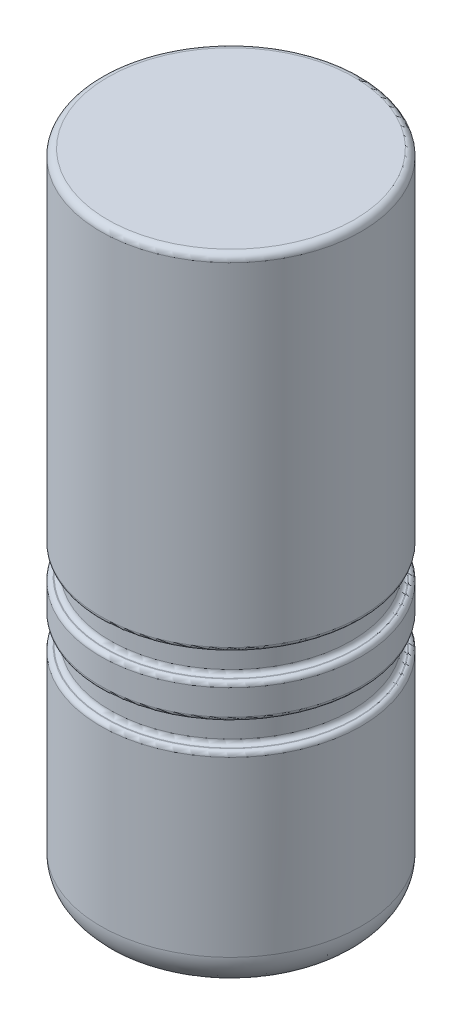
ISO-10303-21;
HEADER;
FILE_DESCRIPTION(('STEP AP214'),'2;1');
FILE_NAME('part.step','',(''),(''),'','','');
FILE_SCHEMA(('AUTOMOTIVE_DESIGN { 1 0 10303 214 1 1 1 1 }'));
ENDSEC;
DATA;
#1=APPLICATION_CONTEXT('core data for automotive mechanical design processes');
#2=APPLICATION_PROTOCOL_DEFINITION('international standard','automotive_design',2000,#1);
#3=PRODUCT_CONTEXT('',#1,'mechanical');
#4=PRODUCT('Part','Part','',(#3));
#5=PRODUCT_RELATED_PRODUCT_CATEGORY('part','',(#4));
#6=PRODUCT_DEFINITION_FORMATION('','',#4);
#7=PRODUCT_DEFINITION_CONTEXT('part definition',#1,'design');
#8=PRODUCT_DEFINITION('design','',#6,#7);
#9=PRODUCT_DEFINITION_SHAPE('','',#8);
#10=(LENGTH_UNIT() NAMED_UNIT(*) SI_UNIT(.MILLI.,.METRE.));
#11=(NAMED_UNIT(*) PLANE_ANGLE_UNIT() SI_UNIT($,.RADIAN.));
#12=(NAMED_UNIT(*) SI_UNIT($,.STERADIAN.) SOLID_ANGLE_UNIT());
#13=UNCERTAINTY_MEASURE_WITH_UNIT(LENGTH_MEASURE(1.E-05),#10,'distance_accuracy_value','');
#14=(GEOMETRIC_REPRESENTATION_CONTEXT(3) GLOBAL_UNCERTAINTY_ASSIGNED_CONTEXT((#13)) GLOBAL_UNIT_ASSIGNED_CONTEXT((#10,
#11,#12)) REPRESENTATION_CONTEXT('',''));
#15=CARTESIAN_POINT('',(0.,0.,0.));
#16=DIRECTION('',(0.,0.,1.));
#17=DIRECTION('',(1.,0.,0.));
#18=AXIS2_PLACEMENT_3D('',#15,#16,#17);
#19=CARTESIAN_POINT('',(0.,3.3,0.));
#20=DIRECTION('',(0.,-1.,0.));
#21=DIRECTION('',(-1.,0.,0.));
#22=AXIS2_PLACEMENT_3D('',#19,#20,#21);
#23=PLANE('',#22);
#24=CARTESIAN_POINT('',(0.,3.3,0.));
#25=DIRECTION('',(0.,-1.,0.));
#26=DIRECTION('',(1.,0.,0.));
#27=AXIS2_PLACEMENT_3D('',#24,#25,#26);
#28=CIRCLE('',#27,3.58);
#29=CARTESIAN_POINT('',(3.58,3.3,0.));
#30=VERTEX_POINT('',#29);
#31=EDGE_CURVE('E26',#30,#30,#28,.T.);
#32=ORIENTED_EDGE('',*,*,#31,.F.);
#33=EDGE_LOOP('',(#32));
#34=FACE_BOUND('',#33,.T.);
#35=ADVANCED_FACE('F16',(#34),#23,.F.);
#36=CARTESIAN_POINT('',(0.,3.1,0.));
#37=DIRECTION('',(0.,1.,0.));
#38=DIRECTION('',(1.,0.,0.));
#39=AXIS2_PLACEMENT_3D('',#36,#37,#38);
#40=TOROIDAL_SURFACE('',#39,3.58,0.2);
#41=ORIENTED_EDGE('',*,*,#31,.T.);
#42=CARTESIAN_POINT('',(3.58,3.1,0.));
#43=DIRECTION('',(0.,0.,1.));
#44=DIRECTION('',(1.,0.,0.));
#45=AXIS2_PLACEMENT_3D('',#42,#43,#44);
#46=CIRCLE('',#45,0.2);
#47=CARTESIAN_POINT('',(3.78,3.1,0.));
#48=VERTEX_POINT('',#47);
#49=EDGE_CURVE('E11',#48,#30,#46,.T.);
#50=ORIENTED_EDGE('',*,*,#49,.F.);
#51=CARTESIAN_POINT('',(0.,3.1,0.));
#52=DIRECTION('',(0.,-1.,0.));
#53=DIRECTION('',(1.,0.,0.));
#54=AXIS2_PLACEMENT_3D('',#51,#52,#53);
#55=CIRCLE('',#54,3.78);
#56=EDGE_CURVE('E115',#48,#48,#55,.T.);
#57=ORIENTED_EDGE('',*,*,#56,.F.);
#58=ORIENTED_EDGE('',*,*,#49,.T.);
#59=EDGE_LOOP('',(#41,#50,#57,#58));
#60=FACE_BOUND('',#59,.T.);
#61=ADVANCED_FACE('F273',(#60),#40,.T.);
#62=CARTESIAN_POINT('',(0.,3.3,0.));
#63=DIRECTION('',(0.,1.,0.));
#64=DIRECTION('',(1.,0.,0.));
#65=AXIS2_PLACEMENT_3D('',#62,#63,#64);
#66=CYLINDRICAL_SURFACE('',#65,3.78);
#67=ORIENTED_EDGE('',*,*,#56,.T.);
#68=DIRECTION('',(0.,-1.,0.));
#69=VECTOR('',#68,1.);
#70=CARTESIAN_POINT('',(3.78,3.3,0.));
#71=LINE('',#70,#69);
#72=CARTESIAN_POINT('',(3.78,-6.57,0.));
#73=VERTEX_POINT('',#72);
#74=EDGE_CURVE('E110',#48,#73,#71,.T.);
#75=ORIENTED_EDGE('',*,*,#74,.T.);
#76=CARTESIAN_POINT('',(0.,-6.57,0.));
#77=DIRECTION('',(0.,-1.,0.));
#78=DIRECTION('',(1.,0.,0.));
#79=AXIS2_PLACEMENT_3D('',#76,#77,#78);
#80=CIRCLE('',#79,3.78);
#81=EDGE_CURVE('E114',#73,#73,#80,.T.);
#82=ORIENTED_EDGE('',*,*,#81,.F.);
#83=ORIENTED_EDGE('',*,*,#74,.F.);
#84=EDGE_LOOP('',(#67,#75,#82,#83));
#85=FACE_BOUND('',#84,.T.);
#86=ADVANCED_FACE('F112',(#85),#66,.T.);
#87=CARTESIAN_POINT('',(0.,-6.57,0.));
#88=DIRECTION('',(0.,1.,0.));
#89=DIRECTION('',(1.,0.,0.));
#90=AXIS2_PLACEMENT_3D('',#87,#88,#89);
#91=TOROIDAL_SURFACE('',#90,3.65,0.13);
#92=ORIENTED_EDGE('',*,*,#81,.T.);
#93=CARTESIAN_POINT('',(3.65,-6.57,0.));
#94=DIRECTION('',(0.,0.,1.));
#95=DIRECTION('',(1.,0.,0.));
#96=AXIS2_PLACEMENT_3D('',#93,#94,#95);
#97=CIRCLE('',#96,0.13);
#98=CARTESIAN_POINT('',(3.65,-6.7,0.));
#99=VERTEX_POINT('',#98);
#100=EDGE_CURVE('E120',#99,#73,#97,.T.);
#101=ORIENTED_EDGE('',*,*,#100,.F.);
#102=CARTESIAN_POINT('',(0.,-6.7,0.));
#103=DIRECTION('',(0.,-1.,0.));
#104=DIRECTION('',(1.,0.,0.));
#105=AXIS2_PLACEMENT_3D('',#102,#103,#104);
#106=CIRCLE('',#105,3.65);
#107=EDGE_CURVE('E123',#99,#99,#106,.T.);
#108=ORIENTED_EDGE('',*,*,#107,.F.);
#109=ORIENTED_EDGE('',*,*,#100,.T.);
#110=EDGE_LOOP('',(#92,#101,#108,#109));
#111=FACE_BOUND('',#110,.T.);
#112=ADVANCED_FACE('F121',(#111),#91,.T.);
#113=CARTESIAN_POINT('',(0.,-6.7,0.));
#114=DIRECTION('',(0.,-1.,0.));
#115=DIRECTION('',(-1.,0.,0.));
#116=AXIS2_PLACEMENT_3D('',#113,#114,#115);
#117=PLANE('',#116);
#118=CARTESIAN_POINT('',(0.,-6.7,0.));
#119=DIRECTION('',(0.,-1.,0.));
#120=DIRECTION('',(1.,0.,0.));
#121=AXIS2_PLACEMENT_3D('',#118,#119,#120);
#122=CIRCLE('',#121,3.63);
#123=CARTESIAN_POINT('',(3.63,-6.7,0.));
#124=VERTEX_POINT('',#123);
#125=EDGE_CURVE('E161',#124,#124,#122,.T.);
#126=ORIENTED_EDGE('',*,*,#125,.F.);
#127=EDGE_LOOP('',(#126));
#128=FACE_BOUND('',#127,.T.);
#129=ORIENTED_EDGE('',*,*,#107,.T.);
#130=EDGE_LOOP('',(#129));
#131=FACE_BOUND('',#130,.T.);
#132=ADVANCED_FACE('F260',(#128,#131),#117,.T.);
#133=CARTESIAN_POINT('',(0.,-6.83,0.));
#134=DIRECTION('',(0.,-1.,0.));
#135=DIRECTION('',(1.,0.,0.));
#136=AXIS2_PLACEMENT_3D('',#133,#134,#135);
#137=TOROIDAL_SURFACE('',#136,3.63,0.13);
#138=ORIENTED_EDGE('',*,*,#125,.T.);
#139=CARTESIAN_POINT('',(3.63,-6.83,0.));
#140=DIRECTION('',(0.,0.,-1.));
#141=DIRECTION('',(1.,0.,0.));
#142=AXIS2_PLACEMENT_3D('',#139,#140,#141);
#143=CIRCLE('',#142,0.13);
#144=CARTESIAN_POINT('',(3.5,-6.83,0.));
#145=VERTEX_POINT('',#144);
#146=EDGE_CURVE('E227',#145,#124,#143,.T.);
#147=ORIENTED_EDGE('',*,*,#146,.F.);
#148=CARTESIAN_POINT('',(0.,-6.83,0.));
#149=DIRECTION('',(0.,-1.,0.));
#150=DIRECTION('',(1.,0.,0.));
#151=AXIS2_PLACEMENT_3D('',#148,#149,#150);
#152=CIRCLE('',#151,3.5);
#153=EDGE_CURVE('E162',#145,#145,#152,.T.);
#154=ORIENTED_EDGE('',*,*,#153,.F.);
#155=ORIENTED_EDGE('',*,*,#146,.T.);
#156=EDGE_LOOP('',(#138,#147,#154,#155));
#157=FACE_BOUND('',#156,.T.);
#158=ADVANCED_FACE('F442',(#157),#137,.F.);
#159=CARTESIAN_POINT('',(0.,-6.7,0.));
#160=DIRECTION('',(0.,1.,0.));
#161=DIRECTION('',(1.,0.,0.));
#162=AXIS2_PLACEMENT_3D('',#159,#160,#161);
#163=CYLINDRICAL_SURFACE('',#162,3.5);
#164=ORIENTED_EDGE('',*,*,#153,.T.);
#165=DIRECTION('',(0.,-1.,0.));
#166=VECTOR('',#165,1.);
#167=CARTESIAN_POINT('',(3.5,-6.7,0.));
#168=LINE('',#167,#166);
#169=CARTESIAN_POINT('',(3.5,-7.32,0.));
#170=VERTEX_POINT('',#169);
#171=EDGE_CURVE('E158',#145,#170,#168,.T.);
#172=ORIENTED_EDGE('',*,*,#171,.T.);
#173=CARTESIAN_POINT('',(0.,-7.32,0.));
#174=DIRECTION('',(0.,-1.,0.));
#175=DIRECTION('',(1.,0.,0.));
#176=AXIS2_PLACEMENT_3D('',#173,#174,#175);
#177=CIRCLE('',#176,3.5);
#178=EDGE_CURVE('E143',#170,#170,#177,.T.);
#179=ORIENTED_EDGE('',*,*,#178,.F.);
#180=ORIENTED_EDGE('',*,*,#171,.F.);
#181=EDGE_LOOP('',(#164,#172,#179,#180));
#182=FACE_BOUND('',#181,.T.);
#183=ADVANCED_FACE('F271',(#182),#163,.T.);
#184=CARTESIAN_POINT('',(0.,-7.32,0.));
#185=DIRECTION('',(0.,-1.,0.));
#186=DIRECTION('',(1.,0.,0.));
#187=AXIS2_PLACEMENT_3D('',#184,#185,#186);
#188=TOROIDAL_SURFACE('',#187,3.63,0.13);
#189=ORIENTED_EDGE('',*,*,#178,.T.);
#190=CARTESIAN_POINT('',(3.63,-7.32,0.));
#191=DIRECTION('',(0.,0.,-1.));
#192=DIRECTION('',(1.,0.,0.));
#193=AXIS2_PLACEMENT_3D('',#190,#191,#192);
#194=CIRCLE('',#193,0.13);
#195=CARTESIAN_POINT('',(3.63,-7.45,0.));
#196=VERTEX_POINT('',#195);
#197=EDGE_CURVE('E146',#196,#170,#194,.T.);
#198=ORIENTED_EDGE('',*,*,#197,.F.);
#199=CARTESIAN_POINT('',(0.,-7.45,0.));
#200=DIRECTION('',(0.,-1.,0.));
#201=DIRECTION('',(1.,0.,0.));
#202=AXIS2_PLACEMENT_3D('',#199,#200,#201);
#203=CIRCLE('',#202,3.63);
#204=EDGE_CURVE('E147',#196,#196,#203,.T.);
#205=ORIENTED_EDGE('',*,*,#204,.F.);
#206=ORIENTED_EDGE('',*,*,#197,.T.);
#207=EDGE_LOOP('',(#189,#198,#205,#206));
#208=FACE_BOUND('',#207,.T.);
#209=ADVANCED_FACE('F262',(#208),#188,.F.);
#210=CARTESIAN_POINT('',(0.,-7.45,0.));
#211=DIRECTION('',(0.,-1.,0.));
#212=DIRECTION('',(-1.,0.,0.));
#213=AXIS2_PLACEMENT_3D('',#210,#211,#212);
#214=PLANE('',#213);
#215=ORIENTED_EDGE('',*,*,#204,.T.);
#216=EDGE_LOOP('',(#215));
#217=FACE_BOUND('',#216,.T.);
#218=CARTESIAN_POINT('',(0.,-7.45,0.));
#219=DIRECTION('',(0.,-1.,0.));
#220=DIRECTION('',(1.,0.,0.));
#221=AXIS2_PLACEMENT_3D('',#218,#219,#220);
#222=CIRCLE('',#221,3.65);
#223=CARTESIAN_POINT('',(3.65,-7.45,0.));
#224=VERTEX_POINT('',#223);
#225=EDGE_CURVE('E137',#224,#224,#222,.T.);
#226=ORIENTED_EDGE('',*,*,#225,.F.);
#227=EDGE_LOOP('',(#226));
#228=FACE_BOUND('',#227,.T.);
#229=ADVANCED_FACE('F270',(#217,#228),#214,.F.);
#230=CARTESIAN_POINT('',(0.,-7.58,0.));
#231=DIRECTION('',(0.,1.,0.));
#232=DIRECTION('',(1.,0.,0.));
#233=AXIS2_PLACEMENT_3D('',#230,#231,#232);
#234=TOROIDAL_SURFACE('',#233,3.65,0.13);
#235=ORIENTED_EDGE('',*,*,#225,.T.);
#236=CARTESIAN_POINT('',(3.65,-7.58,0.));
#237=DIRECTION('',(0.,0.,1.));
#238=DIRECTION('',(1.,0.,0.));
#239=AXIS2_PLACEMENT_3D('',#236,#237,#238);
#240=CIRCLE('',#239,0.13);
#241=CARTESIAN_POINT('',(3.78,-7.58,0.));
#242=VERTEX_POINT('',#241);
#243=EDGE_CURVE('E141',#242,#224,#240,.T.);
#244=ORIENTED_EDGE('',*,*,#243,.F.);
#245=CARTESIAN_POINT('',(0.,-7.58,0.));
#246=DIRECTION('',(0.,-1.,0.));
#247=DIRECTION('',(1.,0.,0.));
#248=AXIS2_PLACEMENT_3D('',#245,#246,#247);
#249=CIRCLE('',#248,3.78);
#250=EDGE_CURVE('E209',#242,#242,#249,.T.);
#251=ORIENTED_EDGE('',*,*,#250,.F.);
#252=ORIENTED_EDGE('',*,*,#243,.T.);
#253=EDGE_LOOP('',(#235,#244,#251,#252));
#254=FACE_BOUND('',#253,.T.);
#255=ADVANCED_FACE('F518',(#254),#234,.T.);
#256=CARTESIAN_POINT('',(0.,-7.45,0.));
#257=DIRECTION('',(0.,1.,0.));
#258=DIRECTION('',(1.,0.,0.));
#259=AXIS2_PLACEMENT_3D('',#256,#257,#258);
#260=CYLINDRICAL_SURFACE('',#259,3.78);
#261=ORIENTED_EDGE('',*,*,#250,.T.);
#262=DIRECTION('',(0.,-1.,0.));
#263=VECTOR('',#262,1.);
#264=CARTESIAN_POINT('',(3.78,-7.45,0.));
#265=LINE('',#264,#263);
#266=CARTESIAN_POINT('',(3.78,-8.32,0.));
#267=VERTEX_POINT('',#266);
#268=EDGE_CURVE('E142',#242,#267,#265,.T.);
#269=ORIENTED_EDGE('',*,*,#268,.T.);
#270=CARTESIAN_POINT('',(0.,-8.32,0.));
#271=DIRECTION('',(0.,-1.,0.));
#272=DIRECTION('',(1.,0.,0.));
#273=AXIS2_PLACEMENT_3D('',#270,#271,#272);
#274=CIRCLE('',#273,3.78);
#275=EDGE_CURVE('E135',#267,#267,#274,.T.);
#276=ORIENTED_EDGE('',*,*,#275,.F.);
#277=ORIENTED_EDGE('',*,*,#268,.F.);
#278=EDGE_LOOP('',(#261,#269,#276,#277));
#279=FACE_BOUND('',#278,.T.);
#280=ADVANCED_FACE('F529',(#279),#260,.T.);
#281=CARTESIAN_POINT('',(0.,-8.32,0.));
#282=DIRECTION('',(0.,1.,0.));
#283=DIRECTION('',(1.,0.,0.));
#284=AXIS2_PLACEMENT_3D('',#281,#282,#283);
#285=TOROIDAL_SURFACE('',#284,3.65,0.13);
#286=ORIENTED_EDGE('',*,*,#275,.T.);
#287=CARTESIAN_POINT('',(3.65,-8.32,0.));
#288=DIRECTION('',(0.,0.,1.));
#289=DIRECTION('',(1.,0.,0.));
#290=AXIS2_PLACEMENT_3D('',#287,#288,#289);
#291=CIRCLE('',#290,0.13);
#292=CARTESIAN_POINT('',(3.65,-8.45,0.));
#293=VERTEX_POINT('',#292);
#294=EDGE_CURVE('E205',#293,#267,#291,.T.);
#295=ORIENTED_EDGE('',*,*,#294,.F.);
#296=CARTESIAN_POINT('',(0.,-8.45,0.));
#297=DIRECTION('',(0.,-1.,0.));
#298=DIRECTION('',(1.,0.,0.));
#299=AXIS2_PLACEMENT_3D('',#296,#297,#298);
#300=CIRCLE('',#299,3.65);
#301=EDGE_CURVE('E214',#293,#293,#300,.T.);
#302=ORIENTED_EDGE('',*,*,#301,.F.);
#303=ORIENTED_EDGE('',*,*,#294,.T.);
#304=EDGE_LOOP('',(#286,#295,#302,#303));
#305=FACE_BOUND('',#304,.T.);
#306=ADVANCED_FACE('F540',(#305),#285,.T.);
#307=CARTESIAN_POINT('',(0.,-8.45,0.));
#308=DIRECTION('',(0.,-1.,0.));
#309=DIRECTION('',(-1.,0.,0.));
#310=AXIS2_PLACEMENT_3D('',#307,#308,#309);
#311=PLANE('',#310);
#312=CARTESIAN_POINT('',(0.,-8.45,0.));
#313=DIRECTION('',(0.,-1.,0.));
#314=DIRECTION('',(1.,0.,0.));
#315=AXIS2_PLACEMENT_3D('',#312,#313,#314);
#316=CIRCLE('',#315,3.63);
#317=CARTESIAN_POINT('',(3.63,-8.45,0.));
#318=VERTEX_POINT('',#317);
#319=EDGE_CURVE('E204',#318,#318,#316,.T.);
#320=ORIENTED_EDGE('',*,*,#319,.F.);
#321=EDGE_LOOP('',(#320));
#322=FACE_BOUND('',#321,.T.);
#323=ORIENTED_EDGE('',*,*,#301,.T.);
#324=EDGE_LOOP('',(#323));
#325=FACE_BOUND('',#324,.T.);
#326=ADVANCED_FACE('F286',(#322,#325),#311,.T.);
#327=CARTESIAN_POINT('',(0.,-8.58,0.));
#328=DIRECTION('',(0.,-1.,0.));
#329=DIRECTION('',(1.,0.,0.));
#330=AXIS2_PLACEMENT_3D('',#327,#328,#329);
#331=TOROIDAL_SURFACE('',#330,3.63,0.13);
#332=ORIENTED_EDGE('',*,*,#319,.T.);
#333=CARTESIAN_POINT('',(3.63,-8.58,0.));
#334=DIRECTION('',(0.,0.,-1.));
#335=DIRECTION('',(1.,0.,0.));
#336=AXIS2_PLACEMENT_3D('',#333,#334,#335);
#337=CIRCLE('',#336,0.13);
#338=CARTESIAN_POINT('',(3.5,-8.58,0.));
#339=VERTEX_POINT('',#338);
#340=EDGE_CURVE('E210',#339,#318,#337,.T.);
#341=ORIENTED_EDGE('',*,*,#340,.F.);
#342=CARTESIAN_POINT('',(0.,-8.58,0.));
#343=DIRECTION('',(0.,-1.,0.));
#344=DIRECTION('',(1.,0.,0.));
#345=AXIS2_PLACEMENT_3D('',#342,#343,#344);
#346=CIRCLE('',#345,3.5);
#347=EDGE_CURVE('E191',#339,#339,#346,.T.);
#348=ORIENTED_EDGE('',*,*,#347,.F.);
#349=ORIENTED_EDGE('',*,*,#340,.T.);
#350=EDGE_LOOP('',(#332,#341,#348,#349));
#351=FACE_BOUND('',#350,.T.);
#352=ADVANCED_FACE('F282',(#351),#331,.F.);
#353=CARTESIAN_POINT('',(0.,-8.45,0.));
#354=DIRECTION('',(0.,1.,0.));
#355=DIRECTION('',(1.,0.,0.));
#356=AXIS2_PLACEMENT_3D('',#353,#354,#355);
#357=CYLINDRICAL_SURFACE('',#356,3.5);
#358=ORIENTED_EDGE('',*,*,#347,.T.);
#359=DIRECTION('',(0.,-1.,0.));
#360=VECTOR('',#359,1.);
#361=CARTESIAN_POINT('',(3.5,-8.45,0.));
#362=LINE('',#361,#360);
#363=CARTESIAN_POINT('',(3.5,-9.07,0.));
#364=VERTEX_POINT('',#363);
#365=EDGE_CURVE('E198',#339,#364,#362,.T.);
#366=ORIENTED_EDGE('',*,*,#365,.T.);
#367=CARTESIAN_POINT('',(0.,-9.07,0.));
#368=DIRECTION('',(0.,-1.,0.));
#369=DIRECTION('',(1.,0.,0.));
#370=AXIS2_PLACEMENT_3D('',#367,#368,#369);
#371=CIRCLE('',#370,3.5);
#372=EDGE_CURVE('E149',#364,#364,#371,.T.);
#373=ORIENTED_EDGE('',*,*,#372,.F.);
#374=ORIENTED_EDGE('',*,*,#365,.F.);
#375=EDGE_LOOP('',(#358,#366,#373,#374));
#376=FACE_BOUND('',#375,.T.);
#377=ADVANCED_FACE('F285',(#376),#357,.T.);
#378=CARTESIAN_POINT('',(0.,-15.7,0.));
#379=DIRECTION('',(0.,-1.,0.));
#380=DIRECTION('',(-1.,0.,0.));
#381=AXIS2_PLACEMENT_3D('',#378,#379,#380);
#382=PLANE('',#381);
#383=CARTESIAN_POINT('',(0.,-15.7,0.));
#384=DIRECTION('',(0.,-1.,0.));
#385=DIRECTION('',(1.,0.,0.));
#386=AXIS2_PLACEMENT_3D('',#383,#384,#385);
#387=CIRCLE('',#386,1.633231163696);
#388=CARTESIAN_POINT('',(1.633231163696,-15.7,0.));
#389=VERTEX_POINT('',#388);
#390=EDGE_CURVE('E154',#389,#389,#387,.T.);
#391=ORIENTED_EDGE('',*,*,#390,.T.);
#392=EDGE_LOOP('',(#391));
#393=FACE_BOUND('',#392,.T.);
#394=ADVANCED_FACE('F577',(#393),#382,.T.);
#395=CARTESIAN_POINT('',(0.,-9.07,0.));
#396=DIRECTION('',(0.,-1.,0.));
#397=DIRECTION('',(1.,0.,0.));
#398=AXIS2_PLACEMENT_3D('',#395,#396,#397);
#399=TOROIDAL_SURFACE('',#398,3.63,0.13);
#400=ORIENTED_EDGE('',*,*,#372,.T.);
#401=CARTESIAN_POINT('',(3.63,-9.07,0.));
#402=DIRECTION('',(0.,0.,-1.));
#403=DIRECTION('',(1.,0.,0.));
#404=AXIS2_PLACEMENT_3D('',#401,#402,#403);
#405=CIRCLE('',#404,0.13);
#406=CARTESIAN_POINT('',(3.63,-9.2,0.));
#407=VERTEX_POINT('',#406);
#408=EDGE_CURVE('E153',#407,#364,#405,.T.);
#409=ORIENTED_EDGE('',*,*,#408,.F.);
#410=CARTESIAN_POINT('',(0.,-9.2,0.));
#411=DIRECTION('',(0.,-1.,0.));
#412=DIRECTION('',(1.,0.,0.));
#413=AXIS2_PLACEMENT_3D('',#410,#411,#412);
#414=CIRCLE('',#413,3.63);
#415=EDGE_CURVE('E177',#407,#407,#414,.T.);
#416=ORIENTED_EDGE('',*,*,#415,.F.);
#417=ORIENTED_EDGE('',*,*,#408,.T.);
#418=EDGE_LOOP('',(#400,#409,#416,#417));
#419=FACE_BOUND('',#418,.T.);
#420=ADVANCED_FACE('F588',(#419),#399,.F.);
#421=CARTESIAN_POINT('',(0.,-14.7,0.));
#422=DIRECTION('',(0.,-1.,0.));
#423=DIRECTION('',(1.,0.,0.));
#424=AXIS2_PLACEMENT_3D('',#421,#422,#423);
#425=TOROIDAL_SURFACE('',#424,1.633231163696,1.);
#426=CARTESIAN_POINT('',(1.633231163696,-14.7,0.));
#427=DIRECTION('',(0.,0.,-1.));
#428=DIRECTION('',(1.,0.,0.));
#429=AXIS2_PLACEMENT_3D('',#426,#427,#428);
#430=CIRCLE('',#429,1.);
#431=CARTESIAN_POINT('',(1.920579049263,-15.65782628522,0.));
#432=VERTEX_POINT('',#431);
#433=EDGE_CURVE('E157',#432,#389,#430,.T.);
#434=ORIENTED_EDGE('',*,*,#433,.F.);
#435=CARTESIAN_POINT('',(0.,-15.65782628522,0.));
#436=DIRECTION('',(0.,-1.,0.));
#437=DIRECTION('',(1.,0.,0.));
#438=AXIS2_PLACEMENT_3D('',#435,#436,#437);
#439=CIRCLE('',#438,1.920579049263);
#440=EDGE_CURVE('E167',#432,#432,#439,.T.);
#441=ORIENTED_EDGE('',*,*,#440,.T.);
#442=ORIENTED_EDGE('',*,*,#433,.T.);
#443=ORIENTED_EDGE('',*,*,#390,.F.);
#444=EDGE_LOOP('',(#434,#441,#442,#443));
#445=FACE_BOUND('',#444,.T.);
#446=ADVANCED_FACE('F280',(#445),#425,.T.);
#447=CARTESIAN_POINT('',(0.,-9.2,0.));
#448=DIRECTION('',(0.,-1.,0.));
#449=DIRECTION('',(-1.,0.,0.));
#450=AXIS2_PLACEMENT_3D('',#447,#448,#449);
#451=PLANE('',#450);
#452=ORIENTED_EDGE('',*,*,#415,.T.);
#453=EDGE_LOOP('',(#452));
#454=FACE_BOUND('',#453,.T.);
#455=CARTESIAN_POINT('',(0.,-9.2,0.));
#456=DIRECTION('',(0.,-1.,0.));
#457=DIRECTION('',(1.,0.,0.));
#458=AXIS2_PLACEMENT_3D('',#455,#456,#457);
#459=CIRCLE('',#458,3.65);
#460=CARTESIAN_POINT('',(3.65,-9.2,0.));
#461=VERTEX_POINT('',#460);
#462=EDGE_CURVE('E189',#461,#461,#459,.T.);
#463=ORIENTED_EDGE('',*,*,#462,.F.);
#464=EDGE_LOOP('',(#463));
#465=FACE_BOUND('',#464,.T.);
#466=ADVANCED_FACE('F276',(#454,#465),#451,.F.);
#467=CARTESIAN_POINT('',(0.,-15.1,0.));
#468=DIRECTION('',(0.,1.,0.));
#469=DIRECTION('',(1.,0.,0.));
#470=AXIS2_PLACEMENT_3D('',#467,#468,#469);
#471=CONICAL_SURFACE('',#470,3.78,1.279339532317);
#472=DIRECTION('',(-0.957826285221234,-0.28734788556607,0.));
#473=VECTOR('',#472,1.);
#474=CARTESIAN_POINT('',(3.78,-15.1,0.));
#475=LINE('',#474,#473);
#476=CARTESIAN_POINT('',(3.067347885566,-15.31379563433,0.));
#477=VERTEX_POINT('',#476);
#478=EDGE_CURVE('E163',#477,#432,#475,.T.);
#479=ORIENTED_EDGE('',*,*,#478,.F.);
#480=CARTESIAN_POINT('',(3.067347885566,-15.31379563433,0.));
#481=CARTESIAN_POINT('',(3.067347885567,-15.31379563433,1.461070906338));
#482=CARTESIAN_POINT('',(2.312218235441,-15.31379563433,2.955835208821));
#483=CARTESIAN_POINT('',(0.758267152084,-15.31379563433,4.024655284967));
#484=CARTESIAN_POINT('',(-1.38016678222,-15.31379563432,4.188805679366));
#485=CARTESIAN_POINT('',(-3.227519172001,-15.31379563433,3.049612665409));
#486=CARTESIAN_POINT('',(-4.582358094654,-15.31379563432,1.386645371005));
#487=CARTESIAN_POINT('',(-4.582358094658,-15.31379563434,-1.386645371029));
#488=CARTESIAN_POINT('',(-3.227519172011,-15.31379563432,-3.049612665366));
#489=CARTESIAN_POINT('',(-1.380166782202,-15.31379563433,-4.188805679403));
#490=CARTESIAN_POINT('',(0.758267152068,-15.31379563432,-4.02465528495));
#491=CARTESIAN_POINT('',(2.312218235448,-15.31379563433,-2.955835208825));
#492=CARTESIAN_POINT('',(3.067347885566,-15.31379563433,-1.461070906337));
#493=CARTESIAN_POINT('',(3.067347885566,-15.31379563433,0.));
#494=(BOUNDED_CURVE() B_SPLINE_CURVE(13,(#480,#481,#482,#483,#484,#485,#486,#487,#488,#489,#490,
#491,#492,#493),.UNSPECIFIED.,.T.,.F.) B_SPLINE_CURVE_WITH_KNOTS((14,14),(0.,23.750440461139),
.UNSPECIFIED.) CURVE() GEOMETRIC_REPRESENTATION_ITEM() RATIONAL_B_SPLINE_CURVE((1.,1.,1.,1.,1.,
1.,1.,1.,1.,1.,1.,1.,1.,1.)) REPRESENTATION_ITEM(''));
#495=EDGE_CURVE('E183',#477,#477,#494,.T.);
#496=ORIENTED_EDGE('',*,*,#495,.T.);
#497=ORIENTED_EDGE('',*,*,#478,.T.);
#498=ORIENTED_EDGE('',*,*,#440,.F.);
#499=EDGE_LOOP('',(#479,#496,#497,#498));
#500=FACE_BOUND('',#499,.T.);
#501=ADVANCED_FACE('F279',(#500),#471,.T.);
#502=CARTESIAN_POINT('',(0.,-9.33,0.));
#503=DIRECTION('',(0.,1.,0.));
#504=DIRECTION('',(1.,0.,0.));
#505=AXIS2_PLACEMENT_3D('',#502,#503,#504);
#506=TOROIDAL_SURFACE('',#505,3.65,0.13);
#507=ORIENTED_EDGE('',*,*,#462,.T.);
#508=CARTESIAN_POINT('',(3.65,-9.33,0.));
#509=DIRECTION('',(0.,0.,1.));
#510=DIRECTION('',(1.,0.,0.));
#511=AXIS2_PLACEMENT_3D('',#508,#509,#510);
#512=CIRCLE('',#511,0.13);
#513=CARTESIAN_POINT('',(3.78,-9.33,0.));
#514=VERTEX_POINT('',#513);
#515=EDGE_CURVE('E168',#514,#461,#512,.T.);
#516=ORIENTED_EDGE('',*,*,#515,.F.);
#517=CARTESIAN_POINT('',(0.,-9.33,0.));
#518=DIRECTION('',(0.,-1.,0.));
#519=DIRECTION('',(1.,0.,0.));
#520=AXIS2_PLACEMENT_3D('',#517,#518,#519);
#521=CIRCLE('',#520,3.78);
#522=EDGE_CURVE('E178',#514,#514,#521,.T.);
#523=ORIENTED_EDGE('',*,*,#522,.F.);
#524=ORIENTED_EDGE('',*,*,#515,.T.);
#525=EDGE_LOOP('',(#507,#516,#523,#524));
#526=FACE_BOUND('',#525,.T.);
#527=ADVANCED_FACE('F259',(#526),#506,.T.);
#528=CARTESIAN_POINT('',(3.78,-14.3559693491,0.));
#529=CARTESIAN_POINT('',(3.780000000002,-14.3559693491,1.800528740788));
#530=CARTESIAN_POINT('',(2.849427341154,-14.3559693491,3.642579031194));
#531=CARTESIAN_POINT('',(0.934439112163,-14.3559693491,4.959723365181));
#532=CARTESIAN_POINT('',(-1.700827761123,-14.3559693491,5.162011633078));
#533=CARTESIAN_POINT('',(-3.9773846741,-14.35596934911,3.758144268382));
#534=CARTESIAN_POINT('',(-5.647000028673,-14.3559693491,1.708811552488));
#535=CARTESIAN_POINT('',(-5.647000028711,-14.35596934911,-1.708811552518));
#536=CARTESIAN_POINT('',(-3.977384674095,-14.3559693491,-3.758144268329));
#537=CARTESIAN_POINT('',(-1.700827761104,-14.35596934911,-5.162011633125));
#538=CARTESIAN_POINT('',(0.934439112141,-14.3559693491,-4.959723365158));
#539=CARTESIAN_POINT('',(2.849427341165,-14.3559693491,-3.6425790312));
#540=CARTESIAN_POINT('',(3.779999999999,-14.3559693491,-1.800528740787));
#541=CARTESIAN_POINT('',(3.78,-14.3559693491,0.));
#542=CARTESIAN_POINT('',(3.78,-15.1,0.));
#543=CARTESIAN_POINT('',(3.780000000001,-15.1,1.800528740788));
#544=CARTESIAN_POINT('',(2.849427341157,-15.1,3.642579031196));
#545=CARTESIAN_POINT('',(0.934439112157001,-15.1,4.959723365173));
#546=CARTESIAN_POINT('',(-1.700827761118,-15.09999999999,5.162011633093));
#547=CARTESIAN_POINT('',(-3.977384674098,-15.1,3.75814426836));
#548=CARTESIAN_POINT('',(-5.647000028683,-15.09999999999,1.70881155251));
#549=CARTESIAN_POINT('',(-5.647000028703,-15.1,-1.708811552532));
#550=CARTESIAN_POINT('',(-3.977384674094,-15.09999999999,-3.758144268322));
#551=CARTESIAN_POINT('',(-1.70082776111,-15.1,-5.162011633127));
#552=CARTESIAN_POINT('',(0.934439112146999,-15.09999999999,-4.959723365157));
#553=CARTESIAN_POINT('',(2.849427341162,-15.1,-3.6425790312));
#554=CARTESIAN_POINT('',(3.78,-15.1,-1.800528740787));
#555=CARTESIAN_POINT('',(3.78,-15.1,0.));
#556=CARTESIAN_POINT('',(3.067347885566,-15.31379563433,0.));
#557=CARTESIAN_POINT('',(3.067347885567,-15.31379563433,1.461070906338));
#558=CARTESIAN_POINT('',(2.312218235441,-15.31379563433,2.955835208821));
#559=CARTESIAN_POINT('',(0.758267152084,-15.31379563433,4.024655284967));
#560=CARTESIAN_POINT('',(-1.38016678222,-15.31379563432,4.188805679366));
#561=CARTESIAN_POINT('',(-3.227519172001,-15.31379563433,3.049612665409));
#562=CARTESIAN_POINT('',(-4.582358094654,-15.31379563432,1.386645371005));
#563=CARTESIAN_POINT('',(-4.582358094658,-15.31379563434,-1.386645371029));
#564=CARTESIAN_POINT('',(-3.227519172011,-15.31379563432,-3.049612665366));
#565=CARTESIAN_POINT('',(-1.380166782202,-15.31379563433,-4.188805679403));
#566=CARTESIAN_POINT('',(0.758267152068001,-15.31379563432,-4.02465528495));
#567=CARTESIAN_POINT('',(2.312218235448,-15.31379563433,-2.955835208825));
#568=CARTESIAN_POINT('',(3.067347885566,-15.31379563433,-1.461070906337));
#569=CARTESIAN_POINT('',(3.067347885566,-15.31379563433,0.));
#570=(BOUNDED_SURFACE() B_SPLINE_SURFACE(2,13,((#528,#529,#530,#531,#532,#533,#534,#535,#536,
#537,#538,#539,#540,#541),(#542,#543,#544,#545,#546,#547,#548,#549,#550,#551,#552,#553,#554,
#555),(#556,#557,#558,#559,#560,#561,#562,#563,#564,#565,#566,#567,#568,#569)),.UNSPECIFIED.,
.F.,.T.,.F.) B_SPLINE_SURFACE_WITH_KNOTS((3,3),(14,14),(0.,23.750440461139),(0.,
23.750440461139),.UNSPECIFIED.) GEOMETRIC_REPRESENTATION_ITEM() RATIONAL_B_SPLINE_SURFACE(((1.,
1.,1.000000000001,0.999999999997,1.000000000005,0.999999999992,1.000000000009,0.999999999991,
1.000000000007,0.999999999996,1.000000000002,0.999999999999,1.,1.),(0.802292928289,
0.802292928289,0.80229292829,0.802292928288,0.802292928292,0.802292928285,0.802292928294,
0.802292928285,0.802292928293,0.802292928287,0.80229292829,0.802292928289,0.802292928289,
0.802292928289),(1.,1.,1.000000000001,0.999999999997,1.000000000005,0.999999999992,
1.000000000009,0.999999999991,1.000000000007,0.999999999996,1.000000000002,0.999999999999,1.,1.))) REPRESENTATION_ITEM('') SURFACE());
#571=CARTESIAN_POINT('',(3.78,-14.3559693491,0.));
#572=CARTESIAN_POINT('',(3.780000000002,-14.3559693491,1.800528740788));
#573=CARTESIAN_POINT('',(2.849427341154,-14.3559693491,3.642579031194));
#574=CARTESIAN_POINT('',(0.934439112163,-14.3559693491,4.959723365181));
#575=CARTESIAN_POINT('',(-1.700827761123,-14.3559693491,5.162011633078));
#576=CARTESIAN_POINT('',(-3.9773846741,-14.35596934911,3.758144268382));
#577=CARTESIAN_POINT('',(-5.647000028673,-14.3559693491,1.708811552488));
#578=CARTESIAN_POINT('',(-5.647000028711,-14.35596934911,-1.708811552518));
#579=CARTESIAN_POINT('',(-3.977384674095,-14.3559693491,-3.758144268329));
#580=CARTESIAN_POINT('',(-1.700827761104,-14.35596934911,-5.162011633125));
#581=CARTESIAN_POINT('',(0.934439112141,-14.3559693491,-4.959723365158));
#582=CARTESIAN_POINT('',(2.849427341165,-14.3559693491,-3.6425790312));
#583=CARTESIAN_POINT('',(3.779999999999,-14.3559693491,-1.800528740787));
#584=CARTESIAN_POINT('',(3.78,-14.3559693491,0.));
#585=(BOUNDED_CURVE() B_SPLINE_CURVE(13,(#571,#572,#573,#574,#575,#576,#577,#578,#579,#580,#581,
#582,#583,#584),.UNSPECIFIED.,.T.,.F.) B_SPLINE_CURVE_WITH_KNOTS((14,14),(0.,23.750440461139),
.UNSPECIFIED.) CURVE() GEOMETRIC_REPRESENTATION_ITEM() RATIONAL_B_SPLINE_CURVE((1.,1.,
1.000000000001,0.999999999997,1.000000000005,0.999999999992,1.000000000009,0.999999999991,
1.000000000007,0.999999999996,1.000000000002,0.999999999999,1.,1.)) REPRESENTATION_ITEM(''));
#586=CARTESIAN_POINT('',(3.78,-14.3559693491,0.));
#587=VERTEX_POINT('',#586);
#588=EDGE_CURVE('E240',#587,#587,#585,.T.);
#589=CARTESIAN_POINT('',(3.78,-14.3559693491,0.));
#590=CARTESIAN_POINT('',(3.78,-15.1,0.));
#591=CARTESIAN_POINT('',(3.067347885566,-15.31379563433,0.));
#592=(BOUNDED_CURVE() B_SPLINE_CURVE(2,(#589,#590,#591),.UNSPECIFIED.,.F.,
.F.) B_SPLINE_CURVE_WITH_KNOTS((3,3),(0.,23.750440461139),
.UNSPECIFIED.) CURVE() GEOMETRIC_REPRESENTATION_ITEM() RATIONAL_B_SPLINE_CURVE((1.,
0.802292928289,1.)) REPRESENTATION_ITEM(''));
#593=EDGE_CURVE('E190',#587,#477,#592,.T.);
#594=ORIENTED_EDGE('',*,*,#588,.T.);
#595=ORIENTED_EDGE('',*,*,#593,.T.);
#596=ORIENTED_EDGE('',*,*,#495,.F.);
#597=ORIENTED_EDGE('',*,*,#593,.F.);
#598=EDGE_LOOP('',(#594,#595,#596,#597));
#599=FACE_BOUND('',#598,.T.);
#600=ADVANCED_FACE('F246',(#599),#570,.F.);
#601=CARTESIAN_POINT('',(0.,-9.2,0.));
#602=DIRECTION('',(0.,1.,0.));
#603=DIRECTION('',(1.,0.,0.));
#604=AXIS2_PLACEMENT_3D('',#601,#602,#603);
#605=CYLINDRICAL_SURFACE('',#604,3.78);
#606=ORIENTED_EDGE('',*,*,#522,.T.);
#607=DIRECTION('',(0.,-1.,0.));
#608=VECTOR('',#607,1.);
#609=CARTESIAN_POINT('',(3.78,-9.2,0.));
#610=LINE('',#609,#608);
#611=EDGE_CURVE('E182',#514,#587,#610,.T.);
#612=ORIENTED_EDGE('',*,*,#611,.T.);
#613=ORIENTED_EDGE('',*,*,#588,.F.);
#614=ORIENTED_EDGE('',*,*,#611,.F.);
#615=EDGE_LOOP('',(#606,#612,#613,#614));
#616=FACE_BOUND('',#615,.T.);
#617=ADVANCED_FACE('F258',(#616),#605,.T.);
#618=CLOSED_SHELL('',(#35,#61,#86,#112,#132,#158,#183,#209,#229,#255,#280,#306,#326,#352,#377,
#394,#420,#446,#466,#501,#527,#600,#617));
#619=MANIFOLD_SOLID_BREP('B1',#618);
#620=ADVANCED_BREP_SHAPE_REPRESENTATION('',(#18,#619),#14);
#621=SHAPE_DEFINITION_REPRESENTATION(#9,#620);
ENDSEC;
END-ISO-10303-21;
